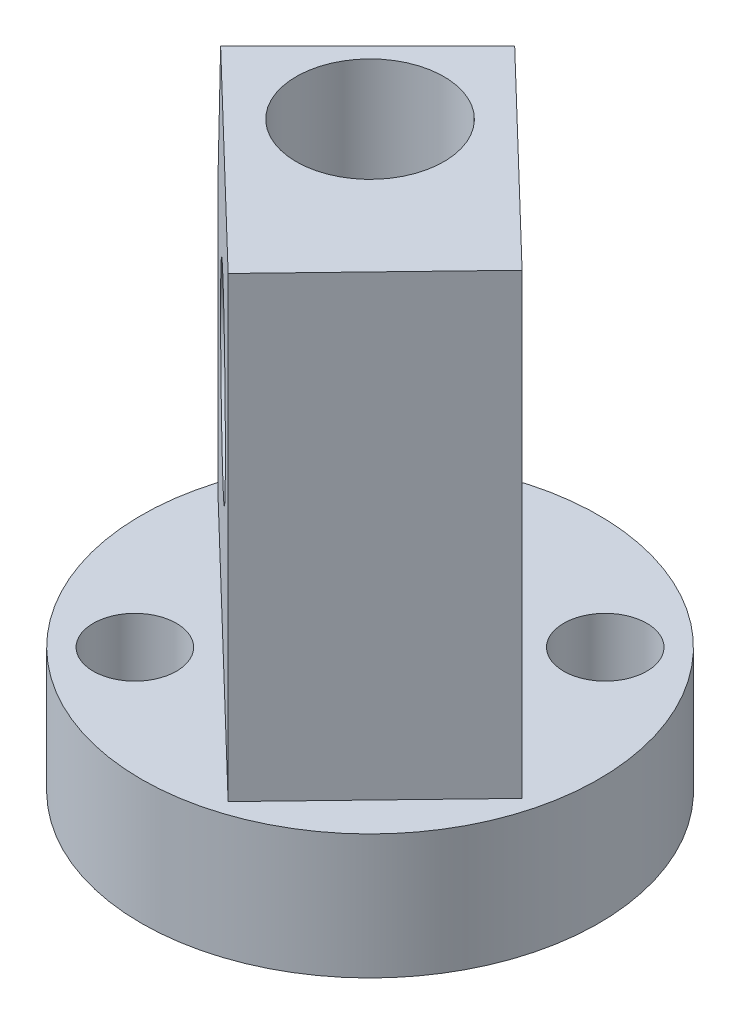
ISO-10303-21;
HEADER;
FILE_DESCRIPTION(('STEP AP214'),'2;1');
FILE_NAME('part.step','',(''),(''),'','','');
FILE_SCHEMA(('AUTOMOTIVE_DESIGN { 1 0 10303 214 1 1 1 1 }'));
ENDSEC;
DATA;
#1=APPLICATION_CONTEXT('core data for automotive mechanical design processes');
#2=APPLICATION_PROTOCOL_DEFINITION('international standard','automotive_design',2000,#1);
#3=PRODUCT_CONTEXT('',#1,'mechanical');
#4=PRODUCT('Part','Part','',(#3));
#5=PRODUCT_RELATED_PRODUCT_CATEGORY('part','',(#4));
#6=PRODUCT_DEFINITION_FORMATION('','',#4);
#7=PRODUCT_DEFINITION_CONTEXT('part definition',#1,'design');
#8=PRODUCT_DEFINITION('design','',#6,#7);
#9=PRODUCT_DEFINITION_SHAPE('','',#8);
#10=(LENGTH_UNIT() NAMED_UNIT(*) SI_UNIT(.MILLI.,.METRE.));
#11=(NAMED_UNIT(*) PLANE_ANGLE_UNIT() SI_UNIT($,.RADIAN.));
#12=(NAMED_UNIT(*) SI_UNIT($,.STERADIAN.) SOLID_ANGLE_UNIT());
#13=UNCERTAINTY_MEASURE_WITH_UNIT(LENGTH_MEASURE(1.E-05),#10,'distance_accuracy_value','');
#14=(GEOMETRIC_REPRESENTATION_CONTEXT(3) GLOBAL_UNCERTAINTY_ASSIGNED_CONTEXT((#13)) GLOBAL_UNIT_ASSIGNED_CONTEXT((#10,
#11,#12)) REPRESENTATION_CONTEXT('',''));
#15=CARTESIAN_POINT('',(0.,0.,0.));
#16=DIRECTION('',(0.,0.,1.));
#17=DIRECTION('',(1.,0.,0.));
#18=AXIS2_PLACEMENT_3D('',#15,#16,#17);
#19=CARTESIAN_POINT('',(0.,6.,0.));
#20=DIRECTION('',(0.,1.,0.));
#21=DIRECTION('',(0.,0.,1.));
#22=AXIS2_PLACEMENT_3D('',#19,#20,#21);
#23=PLANE('',#22);
#24=CARTESIAN_POINT('',(5.65685424949238,6.,-5.65685424949238));
#25=DIRECTION('',(0.,1.,0.));
#26=DIRECTION('',(0.,0.,1.));
#27=AXIS2_PLACEMENT_3D('',#24,#25,#26);
#28=CIRCLE('',#27,1.99999999999999);
#29=CARTESIAN_POINT('',(5.65685424949238,6.,-3.65685424949238));
#30=VERTEX_POINT('',#29);
#31=EDGE_CURVE('E89',#30,#30,#28,.T.);
#32=ORIENTED_EDGE('',*,*,#31,.F.);
#33=EDGE_LOOP('',(#32));
#34=FACE_BOUND('',#33,.T.);
#35=CARTESIAN_POINT('',(-5.65685424949238,6.,5.65685424949238));
#36=DIRECTION('',(0.,1.,0.));
#37=DIRECTION('',(0.,0.,1.));
#38=AXIS2_PLACEMENT_3D('',#35,#36,#37);
#39=CIRCLE('',#38,1.99999999999999);
#40=CARTESIAN_POINT('',(-5.65685424949238,6.,7.65685424949237));
#41=VERTEX_POINT('',#40);
#42=EDGE_CURVE('E106',#41,#41,#39,.T.);
#43=ORIENTED_EDGE('',*,*,#42,.F.);
#44=EDGE_LOOP('',(#43));
#45=FACE_BOUND('',#44,.T.);
#46=CARTESIAN_POINT('',(0.,6.,0.));
#47=DIRECTION('',(0.,1.,0.));
#48=DIRECTION('',(0.,0.,1.));
#49=AXIS2_PLACEMENT_3D('',#46,#47,#48);
#50=CIRCLE('',#49,11.);
#51=CARTESIAN_POINT('',(0.,6.,11.));
#52=VERTEX_POINT('',#51);
#53=EDGE_CURVE('E157',#52,#52,#50,.T.);
#54=ORIENTED_EDGE('',*,*,#53,.T.);
#55=EDGE_LOOP('',(#54));
#56=FACE_BOUND('',#55,.T.);
#57=DIRECTION('',(-0.707106781186547,0.,0.707106781186548));
#58=VECTOR('',#57,1.);
#59=CARTESIAN_POINT('',(-10.0887922112917,6.,-2.77148413762175));
#60=LINE('',#59,#58);
#61=CARTESIAN_POINT('',(-3.01644178236293,6.,-9.84383456655054));
#62=VERTEX_POINT('',#61);
#63=CARTESIAN_POINT('',(-10.0887922112917,6.,-2.77148413762175));
#64=VERTEX_POINT('',#63);
#65=EDGE_CURVE('E142',#62,#64,#60,.T.);
#66=ORIENTED_EDGE('',*,*,#65,.F.);
#67=DIRECTION('',(-0.720444800698293,0.,-0.693512284784341));
#68=VECTOR('',#67,1.);
#69=CARTESIAN_POINT('',(-3.01644178236293,6.,-9.84383456655054));
#70=LINE('',#69,#68);
#71=CARTESIAN_POINT('',(9.95156463020635,6.,2.6393865595676));
#72=VERTEX_POINT('',#71);
#73=EDGE_CURVE('E130',#72,#62,#70,.T.);
#74=ORIENTED_EDGE('',*,*,#73,.F.);
#75=DIRECTION('',(0.693512284784341,0.,-0.720444800698293));
#76=VECTOR('',#75,1.);
#77=CARTESIAN_POINT('',(9.95156463020635,6.,2.6393865595676));
#78=LINE('',#77,#76);
#79=CARTESIAN_POINT('',(3.01644178236294,6.,9.84383456655053));
#80=VERTEX_POINT('',#79);
#81=EDGE_CURVE('E135',#80,#72,#78,.T.);
#82=ORIENTED_EDGE('',*,*,#81,.F.);
#83=DIRECTION('',(0.720444800698294,0.,0.69351228478434));
#84=VECTOR('',#83,1.);
#85=CARTESIAN_POINT('',(3.01644178236294,6.,9.84383456655053));
#86=LINE('',#85,#84);
#87=EDGE_CURVE('E145',#64,#80,#86,.T.);
#88=ORIENTED_EDGE('',*,*,#87,.F.);
#89=EDGE_LOOP('',(#66,#74,#82,#88));
#90=FACE_BOUND('',#89,.T.);
#91=ADVANCED_FACE('F33',(#34,#45,#56,#90),#23,.T.);
#92=CARTESIAN_POINT('',(0.,0.,0.));
#93=DIRECTION('',(0.,1.,0.));
#94=DIRECTION('',(0.,0.,1.));
#95=AXIS2_PLACEMENT_3D('',#92,#93,#94);
#96=CYLINDRICAL_SURFACE('',#95,11.);
#97=CARTESIAN_POINT('',(0.,0.,0.));
#98=DIRECTION('',(0.,1.,0.));
#99=DIRECTION('',(0.,0.,1.));
#100=AXIS2_PLACEMENT_3D('',#97,#98,#99);
#101=CIRCLE('',#100,11.);
#102=CARTESIAN_POINT('',(0.,0.,11.));
#103=VERTEX_POINT('',#102);
#104=EDGE_CURVE('E160',#103,#103,#101,.T.);
#105=ORIENTED_EDGE('',*,*,#104,.T.);
#106=EDGE_LOOP('',(#105));
#107=FACE_BOUND('',#106,.T.);
#108=ORIENTED_EDGE('',*,*,#53,.F.);
#109=EDGE_LOOP('',(#108));
#110=FACE_BOUND('',#109,.T.);
#111=ADVANCED_FACE('F189',(#107,#110),#96,.T.);
#112=CARTESIAN_POINT('',(11.,0.,0.));
#113=DIRECTION('',(0.,-1.,0.));
#114=DIRECTION('',(0.,0.,-1.));
#115=AXIS2_PLACEMENT_3D('',#112,#113,#114);
#116=PLANE('',#115);
#117=CARTESIAN_POINT('',(0.,0.,0.));
#118=DIRECTION('',(0.,-1.,0.));
#119=DIRECTION('',(0.,0.,-1.));
#120=AXIS2_PLACEMENT_3D('',#117,#118,#119);
#121=CIRCLE('',#120,3.99999999999999);
#122=CARTESIAN_POINT('',(0.,0.,-3.99999999999999));
#123=VERTEX_POINT('',#122);
#124=EDGE_CURVE('E90',#123,#123,#121,.T.);
#125=ORIENTED_EDGE('',*,*,#124,.F.);
#126=EDGE_LOOP('',(#125));
#127=FACE_BOUND('',#126,.T.);
#128=CARTESIAN_POINT('',(5.65685424949238,0.,-5.65685424949238));
#129=DIRECTION('',(0.,1.,0.));
#130=DIRECTION('',(0.,0.,1.));
#131=AXIS2_PLACEMENT_3D('',#128,#129,#130);
#132=CIRCLE('',#131,1.25000000000001);
#133=CARTESIAN_POINT('',(5.65685424949238,0.,-4.40685424949237));
#134=VERTEX_POINT('',#133);
#135=EDGE_CURVE('E103',#134,#134,#132,.T.);
#136=ORIENTED_EDGE('',*,*,#135,.T.);
#137=EDGE_LOOP('',(#136));
#138=FACE_BOUND('',#137,.T.);
#139=CARTESIAN_POINT('',(-5.65685424949238,0.,5.65685424949238));
#140=DIRECTION('',(0.,1.,0.));
#141=DIRECTION('',(0.,0.,1.));
#142=AXIS2_PLACEMENT_3D('',#139,#140,#141);
#143=CIRCLE('',#142,1.25000000000001);
#144=CARTESIAN_POINT('',(-5.65685424949238,0.,6.90685424949239));
#145=VERTEX_POINT('',#144);
#146=EDGE_CURVE('E115',#145,#145,#143,.T.);
#147=ORIENTED_EDGE('',*,*,#146,.T.);
#148=EDGE_LOOP('',(#147));
#149=FACE_BOUND('',#148,.T.);
#150=ORIENTED_EDGE('',*,*,#104,.F.);
#151=EDGE_LOOP('',(#150));
#152=FACE_BOUND('',#151,.T.);
#153=ADVANCED_FACE('F195',(#127,#138,#149,#152),#116,.T.);
#154=CARTESIAN_POINT('',(-3.01644178236293,28.,-9.84383456655054));
#155=DIRECTION('',(-0.693512284784341,0.,0.720444800698293));
#156=DIRECTION('',(0.720444800698293,0.,0.693512284784341));
#157=AXIS2_PLACEMENT_3D('',#154,#155,#156);
#158=PLANE('',#157);
#159=CARTESIAN_POINT('',(3.33033384283633,17.,-3.73432158154562));
#160=DIRECTION('',(-0.693512284784341,0.,0.720444800698293));
#161=DIRECTION('',(0.720444800698293,0.,0.693512284784341));
#162=AXIS2_PLACEMENT_3D('',#159,#160,#161);
#163=CIRCLE('',#162,4.25);
#164=CARTESIAN_POINT('',(6.39222424580407,17.,-0.786894371212175));
#165=VERTEX_POINT('',#164);
#166=EDGE_CURVE('E121',#165,#165,#163,.T.);
#167=ORIENTED_EDGE('',*,*,#166,.T.);
#168=EDGE_LOOP('',(#167));
#169=FACE_BOUND('',#168,.T.);
#170=DIRECTION('',(0.,-1.,0.));
#171=VECTOR('',#170,1.);
#172=CARTESIAN_POINT('',(-3.01644178236293,28.,-9.84383456655054));
#173=LINE('',#172,#171);
#174=CARTESIAN_POINT('',(-3.01644178236293,18.9999999999999,-9.84383456655054));
#175=VERTEX_POINT('',#174);
#176=EDGE_CURVE('E155',#175,#62,#173,.T.);
#177=ORIENTED_EDGE('',*,*,#176,.F.);
#178=DIRECTION('',(-0.338276172678976,-0.882912292521152,-0.325630334447987));
#179=VECTOR('',#178,1.);
#180=CARTESIAN_POINT('',(0.41691045904552,27.9611658855183,-6.53883194164332));
#181=LINE('',#180,#179);
#182=CARTESIAN_POINT('',(0.431789236617775,28.,-6.52450938005508));
#183=VERTEX_POINT('',#182);
#184=EDGE_CURVE('E11',#175,#183,#181,.F.);
#185=ORIENTED_EDGE('',*,*,#184,.T.);
#186=DIRECTION('',(-0.720444800698293,0.,-0.693512284784341));
#187=VECTOR('',#186,1.);
#188=CARTESIAN_POINT('',(-3.01644178236293,28.,-9.84383456655054));
#189=LINE('',#188,#187);
#190=CARTESIAN_POINT('',(9.95156463020635,28.,2.6393865595676));
#191=VERTEX_POINT('',#190);
#192=EDGE_CURVE('E131',#191,#183,#189,.T.);
#193=ORIENTED_EDGE('',*,*,#192,.F.);
#194=DIRECTION('',(0.,-1.,0.));
#195=VECTOR('',#194,1.);
#196=CARTESIAN_POINT('',(9.95156463020635,28.,2.6393865595676));
#197=LINE('',#196,#195);
#198=EDGE_CURVE('E139',#191,#72,#197,.T.);
#199=ORIENTED_EDGE('',*,*,#198,.T.);
#200=ORIENTED_EDGE('',*,*,#73,.T.);
#201=EDGE_LOOP('',(#177,#185,#193,#199,#200));
#202=FACE_BOUND('',#201,.T.);
#203=ADVANCED_FACE('F182',(#169,#202),#158,.F.);
#204=CARTESIAN_POINT('',(-10.0887922112917,28.,-2.77148413762175));
#205=DIRECTION('',(0.707106781186548,0.,0.707106781186547));
#206=DIRECTION('',(0.707106781186547,0.,-0.707106781186548));
#207=AXIS2_PLACEMENT_3D('',#204,#205,#206);
#208=PLANE('',#207);
#209=DIRECTION('',(0.,-1.,0.));
#210=VECTOR('',#209,1.);
#211=CARTESIAN_POINT('',(-10.0887922112917,28.,-2.77148413762175));
#212=LINE('',#211,#210);
#213=CARTESIAN_POINT('',(-10.0887922112917,18.9999999999999,-2.77148413762175));
#214=VERTEX_POINT('',#213);
#215=EDGE_CURVE('E153',#214,#64,#212,.T.);
#216=ORIENTED_EDGE('',*,*,#215,.F.);
#217=DIRECTION('',(0.707106781186547,0.,-0.707106781186548));
#218=VECTOR('',#217,1.);
#219=CARTESIAN_POINT('',(-10.0887922112917,18.9999999999999,-2.77148413762175));
#220=LINE('',#219,#218);
#221=EDGE_CURVE('E41',#214,#175,#220,.T.);
#222=ORIENTED_EDGE('',*,*,#221,.T.);
#223=ORIENTED_EDGE('',*,*,#176,.T.);
#224=ORIENTED_EDGE('',*,*,#65,.T.);
#225=EDGE_LOOP('',(#216,#222,#223,#224));
#226=FACE_BOUND('',#225,.T.);
#227=ADVANCED_FACE('F207',(#226),#208,.F.);
#228=CARTESIAN_POINT('',(3.01644178236294,28.,9.84383456655053));
#229=DIRECTION('',(0.69351228478434,0.,-0.720444800698294));
#230=DIRECTION('',(-0.720444800698294,0.,-0.69351228478434));
#231=AXIS2_PLACEMENT_3D('',#228,#229,#230);
#232=PLANE('',#231);
#233=CARTESIAN_POINT('',(-3.60478900500708,17.,3.47012642543732));
#234=DIRECTION('',(-0.693512284784341,0.,0.720444800698293));
#235=DIRECTION('',(0.720444800698293,0.,0.693512284784341));
#236=AXIS2_PLACEMENT_3D('',#233,#234,#235);
#237=CIRCLE('',#236,4.25);
#238=CARTESIAN_POINT('',(-0.542898602039338,17.,6.41755363577076));
#239=VERTEX_POINT('',#238);
#240=EDGE_CURVE('E118',#239,#239,#237,.T.);
#241=ORIENTED_EDGE('',*,*,#240,.F.);
#242=EDGE_LOOP('',(#241));
#243=FACE_BOUND('',#242,.T.);
#244=DIRECTION('',(0.720444800698294,0.,0.69351228478434));
#245=VECTOR('',#244,1.);
#246=CARTESIAN_POINT('',(3.01644178236294,28.,9.84383456655053));
#247=LINE('',#246,#245);
#248=CARTESIAN_POINT('',(-6.64056119231101,28.,0.547841048873714));
#249=VERTEX_POINT('',#248);
#250=CARTESIAN_POINT('',(3.01644178236294,28.,9.84383456655053));
#251=VERTEX_POINT('',#250);
#252=EDGE_CURVE('E134',#249,#251,#247,.T.);
#253=ORIENTED_EDGE('',*,*,#252,.F.);
#254=DIRECTION('',(0.338276172678976,0.882912292521152,0.325630334447987));
#255=VECTOR('',#254,1.);
#256=CARTESIAN_POINT('',(-6.6251859699492,28.0401298522328,0.562641496567792));
#257=LINE('',#256,#255);
#258=EDGE_CURVE('E55',#249,#214,#257,.F.);
#259=ORIENTED_EDGE('',*,*,#258,.T.);
#260=ORIENTED_EDGE('',*,*,#215,.T.);
#261=ORIENTED_EDGE('',*,*,#87,.T.);
#262=DIRECTION('',(0.,-1.,0.));
#263=VECTOR('',#262,1.);
#264=CARTESIAN_POINT('',(3.01644178236294,28.,9.84383456655053));
#265=LINE('',#264,#263);
#266=EDGE_CURVE('E151',#251,#80,#265,.T.);
#267=ORIENTED_EDGE('',*,*,#266,.F.);
#268=EDGE_LOOP('',(#253,#259,#260,#261,#267));
#269=FACE_BOUND('',#268,.T.);
#270=ADVANCED_FACE('F173',(#243,#269),#232,.F.);
#271=CARTESIAN_POINT('',(9.95156463020635,28.,2.6393865595676));
#272=DIRECTION('',(-0.720444800698293,0.,-0.693512284784341));
#273=DIRECTION('',(-0.693512284784341,0.,0.720444800698293));
#274=AXIS2_PLACEMENT_3D('',#271,#272,#273);
#275=PLANE('',#274);
#276=ORIENTED_EDGE('',*,*,#81,.T.);
#277=ORIENTED_EDGE('',*,*,#198,.F.);
#278=DIRECTION('',(0.693512284784341,0.,-0.720444800698293));
#279=VECTOR('',#278,1.);
#280=CARTESIAN_POINT('',(9.95156463020635,28.,2.6393865595676));
#281=LINE('',#280,#279);
#282=EDGE_CURVE('E137',#251,#191,#281,.T.);
#283=ORIENTED_EDGE('',*,*,#282,.F.);
#284=ORIENTED_EDGE('',*,*,#266,.T.);
#285=EDGE_LOOP('',(#276,#277,#283,#284));
#286=FACE_BOUND('',#285,.T.);
#287=ADVANCED_FACE('F179',(#286),#275,.F.);
#288=CARTESIAN_POINT('',(0.,28.,0.));
#289=DIRECTION('',(0.,-1.,0.));
#290=DIRECTION('',(0.,0.,-1.));
#291=AXIS2_PLACEMENT_3D('',#288,#289,#290);
#292=PLANE('',#291);
#293=CARTESIAN_POINT('',(0.,28.,0.));
#294=DIRECTION('',(0.,1.,0.));
#295=DIRECTION('',(0.,0.,1.));
#296=AXIS2_PLACEMENT_3D('',#293,#294,#295);
#297=CIRCLE('',#296,3.54999999999999);
#298=CARTESIAN_POINT('',(0.,28.,3.54999999999999));
#299=VERTEX_POINT('',#298);
#300=EDGE_CURVE('E124',#299,#299,#297,.T.);
#301=ORIENTED_EDGE('',*,*,#300,.F.);
#302=EDGE_LOOP('',(#301));
#303=FACE_BOUND('',#302,.T.);
#304=ORIENTED_EDGE('',*,*,#192,.T.);
#305=DIRECTION('',(-0.707106781186547,0.,0.707106781186548));
#306=VECTOR('',#305,1.);
#307=CARTESIAN_POINT('',(-3.04636007171865,28.,-3.04636007171865));
#308=LINE('',#307,#306);
#309=EDGE_CURVE('E163',#183,#249,#308,.T.);
#310=ORIENTED_EDGE('',*,*,#309,.T.);
#311=ORIENTED_EDGE('',*,*,#252,.T.);
#312=ORIENTED_EDGE('',*,*,#282,.T.);
#313=EDGE_LOOP('',(#304,#310,#311,#312));
#314=FACE_BOUND('',#313,.T.);
#315=ADVANCED_FACE('F168',(#303,#314),#292,.F.);
#316=CARTESIAN_POINT('',(0.,22.,0.));
#317=DIRECTION('',(0.,-1.,0.));
#318=DIRECTION('',(0.,0.,-1.));
#319=AXIS2_PLACEMENT_3D('',#316,#317,#318);
#320=PLANE('',#319);
#321=CARTESIAN_POINT('',(0.,22.,0.));
#322=DIRECTION('',(0.,1.,0.));
#323=DIRECTION('',(0.,0.,1.));
#324=AXIS2_PLACEMENT_3D('',#321,#322,#323);
#325=CIRCLE('',#324,3.54999999999999);
#326=CARTESIAN_POINT('',(0.,22.,3.54999999999999));
#327=VERTEX_POINT('',#326);
#328=EDGE_CURVE('E127',#327,#327,#325,.T.);
#329=ORIENTED_EDGE('',*,*,#328,.T.);
#330=EDGE_LOOP('',(#329));
#331=FACE_BOUND('',#330,.T.);
#332=ADVANCED_FACE('F232',(#331),#320,.F.);
#333=CARTESIAN_POINT('',(0.,28.,0.));
#334=DIRECTION('',(0.,1.,0.));
#335=DIRECTION('',(0.,0.,1.));
#336=AXIS2_PLACEMENT_3D('',#333,#334,#335);
#337=CYLINDRICAL_SURFACE('',#336,3.54999999999999);
#338=ORIENTED_EDGE('',*,*,#328,.F.);
#339=EDGE_LOOP('',(#338));
#340=FACE_BOUND('',#339,.T.);
#341=ORIENTED_EDGE('',*,*,#300,.T.);
#342=EDGE_LOOP('',(#341));
#343=FACE_BOUND('',#342,.T.);
#344=ADVANCED_FACE('F236',(#340,#343),#337,.F.);
#345=CARTESIAN_POINT('',(-3.60478900500708,17.,3.47012642543732));
#346=DIRECTION('',(-0.693512284784341,0.,0.720444800698293));
#347=DIRECTION('',(0.720444800698293,0.,0.693512284784341));
#348=AXIS2_PLACEMENT_3D('',#345,#346,#347);
#349=CYLINDRICAL_SURFACE('',#348,4.25);
#350=ORIENTED_EDGE('',*,*,#240,.T.);
#351=EDGE_LOOP('',(#350));
#352=FACE_BOUND('',#351,.T.);
#353=ORIENTED_EDGE('',*,*,#166,.F.);
#354=EDGE_LOOP('',(#353));
#355=FACE_BOUND('',#354,.T.);
#356=ADVANCED_FACE('F240',(#352,#355),#349,.F.);
#357=CARTESIAN_POINT('',(-5.65685424949238,6.,5.65685424949238));
#358=DIRECTION('',(0.,1.,0.));
#359=DIRECTION('',(0.,0.,1.));
#360=AXIS2_PLACEMENT_3D('',#357,#358,#359);
#361=CYLINDRICAL_SURFACE('',#360,1.25000000000001);
#362=ORIENTED_EDGE('',*,*,#146,.F.);
#363=EDGE_LOOP('',(#362));
#364=FACE_BOUND('',#363,.T.);
#365=CARTESIAN_POINT('',(-5.65685424949238,1.5,5.65685424949238));
#366=DIRECTION('',(0.,1.,0.));
#367=DIRECTION('',(0.,0.,1.));
#368=AXIS2_PLACEMENT_3D('',#365,#366,#367);
#369=CIRCLE('',#368,1.25000000000001);
#370=CARTESIAN_POINT('',(-5.65685424949238,1.5,6.90685424949239));
#371=VERTEX_POINT('',#370);
#372=EDGE_CURVE('E112',#371,#371,#369,.T.);
#373=ORIENTED_EDGE('',*,*,#372,.T.);
#374=EDGE_LOOP('',(#373));
#375=FACE_BOUND('',#374,.T.);
#376=ADVANCED_FACE('F244',(#364,#375),#361,.F.);
#377=CARTESIAN_POINT('',(-4.40685424949237,1.5,5.65685424949238));
#378=DIRECTION('',(0.,-1.,0.));
#379=DIRECTION('',(0.,0.,-1.));
#380=AXIS2_PLACEMENT_3D('',#377,#378,#379);
#381=PLANE('',#380);
#382=ORIENTED_EDGE('',*,*,#372,.F.);
#383=EDGE_LOOP('',(#382));
#384=FACE_BOUND('',#383,.T.);
#385=CARTESIAN_POINT('',(-5.65685424949238,1.5,5.65685424949238));
#386=DIRECTION('',(0.,1.,0.));
#387=DIRECTION('',(0.,0.,1.));
#388=AXIS2_PLACEMENT_3D('',#385,#386,#387);
#389=CIRCLE('',#388,1.99999999999999);
#390=CARTESIAN_POINT('',(-5.65685424949238,1.5,7.65685424949237));
#391=VERTEX_POINT('',#390);
#392=EDGE_CURVE('E109',#391,#391,#389,.T.);
#393=ORIENTED_EDGE('',*,*,#392,.T.);
#394=EDGE_LOOP('',(#393));
#395=FACE_BOUND('',#394,.T.);
#396=ADVANCED_FACE('F248',(#384,#395),#381,.F.);
#397=CARTESIAN_POINT('',(-5.65685424949238,6.,5.65685424949238));
#398=DIRECTION('',(0.,1.,0.));
#399=DIRECTION('',(0.,0.,1.));
#400=AXIS2_PLACEMENT_3D('',#397,#398,#399);
#401=CYLINDRICAL_SURFACE('',#400,1.99999999999999);
#402=ORIENTED_EDGE('',*,*,#392,.F.);
#403=EDGE_LOOP('',(#402));
#404=FACE_BOUND('',#403,.T.);
#405=ORIENTED_EDGE('',*,*,#42,.T.);
#406=EDGE_LOOP('',(#405));
#407=FACE_BOUND('',#406,.T.);
#408=ADVANCED_FACE('F252',(#404,#407),#401,.F.);
#409=CARTESIAN_POINT('',(5.65685424949238,6.,-5.65685424949238));
#410=DIRECTION('',(0.,1.,0.));
#411=DIRECTION('',(0.,0.,1.));
#412=AXIS2_PLACEMENT_3D('',#409,#410,#411);
#413=CYLINDRICAL_SURFACE('',#412,1.25000000000001);
#414=ORIENTED_EDGE('',*,*,#135,.F.);
#415=EDGE_LOOP('',(#414));
#416=FACE_BOUND('',#415,.T.);
#417=CARTESIAN_POINT('',(5.65685424949238,1.5,-5.65685424949238));
#418=DIRECTION('',(0.,1.,0.));
#419=DIRECTION('',(0.,0.,1.));
#420=AXIS2_PLACEMENT_3D('',#417,#418,#419);
#421=CIRCLE('',#420,1.25000000000001);
#422=CARTESIAN_POINT('',(5.65685424949238,1.5,-4.40685424949237));
#423=VERTEX_POINT('',#422);
#424=EDGE_CURVE('E100',#423,#423,#421,.T.);
#425=ORIENTED_EDGE('',*,*,#424,.T.);
#426=EDGE_LOOP('',(#425));
#427=FACE_BOUND('',#426,.T.);
#428=ADVANCED_FACE('F256',(#416,#427),#413,.F.);
#429=CARTESIAN_POINT('',(6.90685424949239,1.5,-5.65685424949238));
#430=DIRECTION('',(0.,-1.,0.));
#431=DIRECTION('',(0.,0.,-1.));
#432=AXIS2_PLACEMENT_3D('',#429,#430,#431);
#433=PLANE('',#432);
#434=ORIENTED_EDGE('',*,*,#424,.F.);
#435=EDGE_LOOP('',(#434));
#436=FACE_BOUND('',#435,.T.);
#437=CARTESIAN_POINT('',(5.65685424949238,1.5,-5.65685424949238));
#438=DIRECTION('',(0.,1.,0.));
#439=DIRECTION('',(0.,0.,1.));
#440=AXIS2_PLACEMENT_3D('',#437,#438,#439);
#441=CIRCLE('',#440,1.99999999999999);
#442=CARTESIAN_POINT('',(5.65685424949238,1.5,-3.65685424949238));
#443=VERTEX_POINT('',#442);
#444=EDGE_CURVE('E93',#443,#443,#441,.T.);
#445=ORIENTED_EDGE('',*,*,#444,.T.);
#446=EDGE_LOOP('',(#445));
#447=FACE_BOUND('',#446,.T.);
#448=ADVANCED_FACE('F260',(#436,#447),#433,.F.);
#449=CARTESIAN_POINT('',(5.65685424949238,6.,-5.65685424949238));
#450=DIRECTION('',(0.,1.,0.));
#451=DIRECTION('',(0.,0.,1.));
#452=AXIS2_PLACEMENT_3D('',#449,#450,#451);
#453=CYLINDRICAL_SURFACE('',#452,1.99999999999999);
#454=ORIENTED_EDGE('',*,*,#444,.F.);
#455=EDGE_LOOP('',(#454));
#456=FACE_BOUND('',#455,.T.);
#457=ORIENTED_EDGE('',*,*,#31,.T.);
#458=EDGE_LOOP('',(#457));
#459=FACE_BOUND('',#458,.T.);
#460=ADVANCED_FACE('F83',(#456,#459),#453,.F.);
#461=CARTESIAN_POINT('',(0.,2.,0.));
#462=DIRECTION('',(0.,-1.,0.));
#463=DIRECTION('',(0.,0.,-1.));
#464=AXIS2_PLACEMENT_3D('',#461,#462,#463);
#465=CONICAL_SURFACE('',#464,3.99999999999999,0.785398163397448);
#466=CARTESIAN_POINT('',(0.,5.99999999999999,0.));
#467=VERTEX_POINT('',#466);
#468=VERTEX_LOOP('',#467);
#469=FACE_BOUND('',#468,.T.);
#470=CARTESIAN_POINT('',(0.,2.,0.));
#471=DIRECTION('',(0.,-1.,0.));
#472=DIRECTION('',(0.,0.,-1.));
#473=AXIS2_PLACEMENT_3D('',#470,#471,#472);
#474=CIRCLE('',#473,3.99999999999999);
#475=CARTESIAN_POINT('',(0.,2.,-3.99999999999999));
#476=VERTEX_POINT('',#475);
#477=EDGE_CURVE('E87',#476,#476,#474,.T.);
#478=ORIENTED_EDGE('',*,*,#477,.T.);
#479=EDGE_LOOP('',(#478));
#480=FACE_BOUND('',#479,.T.);
#481=ADVANCED_FACE('F79',(#469,#480),#465,.F.);
#482=CARTESIAN_POINT('',(0.,0.,0.));
#483=DIRECTION('',(0.,-1.,0.));
#484=DIRECTION('',(0.,0.,-1.));
#485=AXIS2_PLACEMENT_3D('',#482,#483,#484);
#486=CYLINDRICAL_SURFACE('',#485,3.99999999999999);
#487=ORIENTED_EDGE('',*,*,#477,.F.);
#488=EDGE_LOOP('',(#487));
#489=FACE_BOUND('',#488,.T.);
#490=ORIENTED_EDGE('',*,*,#124,.T.);
#491=EDGE_LOOP('',(#490));
#492=FACE_BOUND('',#491,.T.);
#493=ADVANCED_FACE('F82',(#489,#492),#486,.F.);
#494=CARTESIAN_POINT('',(-3.04636007171865,28.,-3.04636007171865));
#495=DIRECTION('',(0.624338230342887,-0.469471562785888,0.624338230342887));
#496=DIRECTION('',(-0.707106781186547,0.,0.707106781186548));
#497=AXIS2_PLACEMENT_3D('',#494,#495,#496);
#498=PLANE('',#497);
#499=ORIENTED_EDGE('',*,*,#184,.F.);
#500=ORIENTED_EDGE('',*,*,#221,.F.);
#501=ORIENTED_EDGE('',*,*,#258,.F.);
#502=ORIENTED_EDGE('',*,*,#309,.F.);
#503=EDGE_LOOP('',(#499,#500,#501,#502));
#504=FACE_BOUND('',#503,.T.);
#505=ADVANCED_FACE('F35',(#504),#498,.F.);
#506=CLOSED_SHELL('',(#91,#111,#153,#203,#227,#270,#287,#315,#332,#344,#356,#376,#396,#408,#428,
#448,#460,#481,#493,#505));
#507=MANIFOLD_SOLID_BREP('B2',#506);
#508=ADVANCED_BREP_SHAPE_REPRESENTATION('',(#18,#507),#14);
#509=SHAPE_DEFINITION_REPRESENTATION(#9,#508);
ENDSEC;
END-ISO-10303-21;
